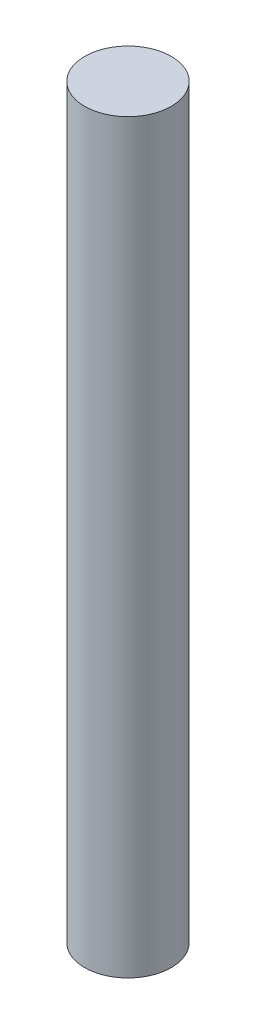
ISO-10303-21;
HEADER;
FILE_DESCRIPTION(('STEP AP214'),'2;1');
FILE_NAME('part.step','',(''),(''),'','','');
FILE_SCHEMA(('AUTOMOTIVE_DESIGN { 1 0 10303 214 1 1 1 1 }'));
ENDSEC;
DATA;
#1=APPLICATION_CONTEXT('core data for automotive mechanical design processes');
#2=APPLICATION_PROTOCOL_DEFINITION('international standard','automotive_design',2000,#1);
#3=PRODUCT_CONTEXT('',#1,'mechanical');
#4=PRODUCT('Part','Part','',(#3));
#5=PRODUCT_RELATED_PRODUCT_CATEGORY('part','',(#4));
#6=PRODUCT_DEFINITION_FORMATION('','',#4);
#7=PRODUCT_DEFINITION_CONTEXT('part definition',#1,'design');
#8=PRODUCT_DEFINITION('design','',#6,#7);
#9=PRODUCT_DEFINITION_SHAPE('','',#8);
#10=(LENGTH_UNIT() NAMED_UNIT(*) SI_UNIT(.MILLI.,.METRE.));
#11=(NAMED_UNIT(*) PLANE_ANGLE_UNIT() SI_UNIT($,.RADIAN.));
#12=(NAMED_UNIT(*) SI_UNIT($,.STERADIAN.) SOLID_ANGLE_UNIT());
#13=UNCERTAINTY_MEASURE_WITH_UNIT(LENGTH_MEASURE(1.E-05),#10,'distance_accuracy_value','');
#14=(GEOMETRIC_REPRESENTATION_CONTEXT(3) GLOBAL_UNCERTAINTY_ASSIGNED_CONTEXT((#13)) GLOBAL_UNIT_ASSIGNED_CONTEXT((#10,
#11,#12)) REPRESENTATION_CONTEXT('',''));
#15=CARTESIAN_POINT('',(0.,0.,0.));
#16=DIRECTION('',(0.,0.,1.));
#17=DIRECTION('',(1.,0.,0.));
#18=AXIS2_PLACEMENT_3D('',#15,#16,#17);
#19=CARTESIAN_POINT('',(0.,88.9,0.));
#20=DIRECTION('',(0.,-1.,0.));
#21=DIRECTION('',(0.,0.,-1.));
#22=AXIS2_PLACEMENT_3D('',#19,#20,#21);
#23=CYLINDRICAL_SURFACE('',#22,5.159375);
#24=CARTESIAN_POINT('',(0.,88.9,0.));
#25=DIRECTION('',(0.,1.,0.));
#26=DIRECTION('',(0.,0.,1.));
#27=AXIS2_PLACEMENT_3D('',#24,#25,#26);
#28=CIRCLE('',#27,5.159375);
#29=CARTESIAN_POINT('',(0.,88.9,5.159375));
#30=VERTEX_POINT('',#29);
#31=EDGE_CURVE('E10',#30,#30,#28,.T.);
#32=ORIENTED_EDGE('',*,*,#31,.F.);
#33=EDGE_LOOP('',(#32));
#34=FACE_BOUND('',#33,.T.);
#35=CARTESIAN_POINT('',(0.,0.,0.));
#36=DIRECTION('',(0.,1.,0.));
#37=DIRECTION('',(0.,0.,1.));
#38=AXIS2_PLACEMENT_3D('',#35,#36,#37);
#39=CIRCLE('',#38,5.159375);
#40=CARTESIAN_POINT('',(0.,0.,5.159375));
#41=VERTEX_POINT('',#40);
#42=EDGE_CURVE('E46',#41,#41,#39,.T.);
#43=ORIENTED_EDGE('',*,*,#42,.T.);
#44=EDGE_LOOP('',(#43));
#45=FACE_BOUND('',#44,.T.);
#46=ADVANCED_FACE('F43',(#34,#45),#23,.T.);
#47=CARTESIAN_POINT('',(0.,88.9,0.));
#48=DIRECTION('',(0.,1.,0.));
#49=DIRECTION('',(0.,0.,1.));
#50=AXIS2_PLACEMENT_3D('',#47,#48,#49);
#51=PLANE('',#50);
#52=ORIENTED_EDGE('',*,*,#31,.T.);
#53=EDGE_LOOP('',(#52));
#54=FACE_BOUND('',#53,.T.);
#55=ADVANCED_FACE('F60',(#54),#51,.T.);
#56=CARTESIAN_POINT('',(0.,0.,0.));
#57=DIRECTION('',(0.,1.,0.));
#58=DIRECTION('',(0.,0.,1.));
#59=AXIS2_PLACEMENT_3D('',#56,#57,#58);
#60=PLANE('',#59);
#61=ORIENTED_EDGE('',*,*,#42,.F.);
#62=EDGE_LOOP('',(#61));
#63=FACE_BOUND('',#62,.T.);
#64=ADVANCED_FACE('F58',(#63),#60,.F.);
#65=CLOSED_SHELL('',(#46,#55,#64));
#66=MANIFOLD_SOLID_BREP('B2',#65);
#67=ADVANCED_BREP_SHAPE_REPRESENTATION('',(#18,#66),#14);
#68=SHAPE_DEFINITION_REPRESENTATION(#9,#67);
ENDSEC;
END-ISO-10303-21;
